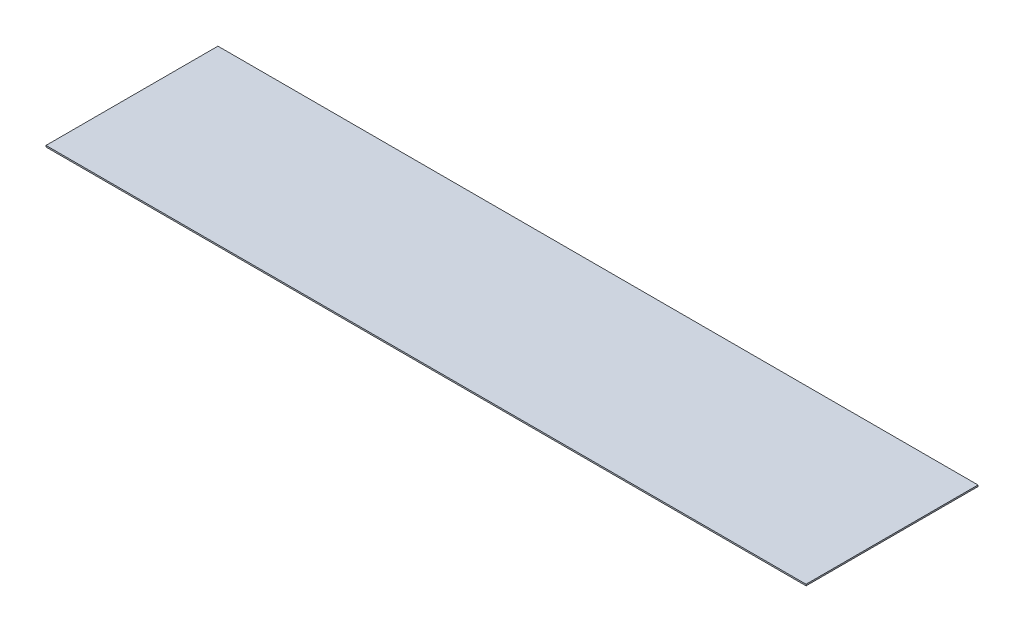
ISO-10303-21;
HEADER;
FILE_DESCRIPTION(('STEP AP214'),'2;1');
FILE_NAME('part.step','',(''),(''),'','','');
FILE_SCHEMA(('AUTOMOTIVE_DESIGN { 1 0 10303 214 1 1 1 1 }'));
ENDSEC;
DATA;
#1=APPLICATION_CONTEXT('core data for automotive mechanical design processes');
#2=APPLICATION_PROTOCOL_DEFINITION('international standard','automotive_design',2000,#1);
#3=PRODUCT_CONTEXT('',#1,'mechanical');
#4=PRODUCT('Part','Part','',(#3));
#5=PRODUCT_RELATED_PRODUCT_CATEGORY('part','',(#4));
#6=PRODUCT_DEFINITION_FORMATION('','',#4);
#7=PRODUCT_DEFINITION_CONTEXT('part definition',#1,'design');
#8=PRODUCT_DEFINITION('design','',#6,#7);
#9=PRODUCT_DEFINITION_SHAPE('','',#8);
#10=(LENGTH_UNIT() NAMED_UNIT(*) SI_UNIT(.MILLI.,.METRE.));
#11=(NAMED_UNIT(*) PLANE_ANGLE_UNIT() SI_UNIT($,.RADIAN.));
#12=(NAMED_UNIT(*) SI_UNIT($,.STERADIAN.) SOLID_ANGLE_UNIT());
#13=UNCERTAINTY_MEASURE_WITH_UNIT(LENGTH_MEASURE(1.E-05),#10,'distance_accuracy_value','');
#14=(GEOMETRIC_REPRESENTATION_CONTEXT(3) GLOBAL_UNCERTAINTY_ASSIGNED_CONTEXT((#13)) GLOBAL_UNIT_ASSIGNED_CONTEXT((#10,
#11,#12)) REPRESENTATION_CONTEXT('',''));
#15=CARTESIAN_POINT('',(0.,0.,0.));
#16=DIRECTION('',(0.,0.,1.));
#17=DIRECTION('',(1.,0.,0.));
#18=AXIS2_PLACEMENT_3D('',#15,#16,#17);
#19=CARTESIAN_POINT('',(6737.35,330.2,-1524.));
#20=DIRECTION('',(-1.,0.,0.));
#21=DIRECTION('',(0.,0.,1.));
#22=AXIS2_PLACEMENT_3D('',#19,#20,#21);
#23=PLANE('',#22);
#24=DIRECTION('',(0.,0.,-1.));
#25=VECTOR('',#24,1.);
#26=CARTESIAN_POINT('',(6737.35,304.8,-1524.));
#27=LINE('',#26,#25);
#28=CARTESIAN_POINT('',(6737.35,304.8,1524.));
#29=VERTEX_POINT('',#28);
#30=CARTESIAN_POINT('',(6737.35,304.8,-1524.));
#31=VERTEX_POINT('',#30);
#32=EDGE_CURVE('E109',#29,#31,#27,.T.);
#33=ORIENTED_EDGE('',*,*,#32,.T.);
#34=DIRECTION('',(0.,-1.,0.));
#35=VECTOR('',#34,1.);
#36=CARTESIAN_POINT('',(6737.35,330.2,-1524.));
#37=LINE('',#36,#35);
#38=CARTESIAN_POINT('',(6737.35,330.2,-1524.));
#39=VERTEX_POINT('',#38);
#40=EDGE_CURVE('E12',#39,#31,#37,.T.);
#41=ORIENTED_EDGE('',*,*,#40,.F.);
#42=DIRECTION('',(0.,0.,-1.));
#43=VECTOR('',#42,1.);
#44=CARTESIAN_POINT('',(6737.35,330.2,-1524.));
#45=LINE('',#44,#43);
#46=CARTESIAN_POINT('',(6737.35,330.2,1524.));
#47=VERTEX_POINT('',#46);
#48=EDGE_CURVE('E97',#47,#39,#45,.T.);
#49=ORIENTED_EDGE('',*,*,#48,.F.);
#50=DIRECTION('',(0.,-1.,0.));
#51=VECTOR('',#50,1.);
#52=CARTESIAN_POINT('',(6737.35,330.2,1524.));
#53=LINE('',#52,#51);
#54=EDGE_CURVE('E105',#47,#29,#53,.T.);
#55=ORIENTED_EDGE('',*,*,#54,.T.);
#56=EDGE_LOOP('',(#33,#41,#49,#55));
#57=FACE_BOUND('',#56,.T.);
#58=ADVANCED_FACE('F46',(#57),#23,.F.);
#59=CARTESIAN_POINT('',(-6737.35,330.2,-1524.));
#60=DIRECTION('',(0.,0.,1.));
#61=DIRECTION('',(1.,0.,0.));
#62=AXIS2_PLACEMENT_3D('',#59,#60,#61);
#63=PLANE('',#62);
#64=DIRECTION('',(-1.,0.,0.));
#65=VECTOR('',#64,1.);
#66=CARTESIAN_POINT('',(-6737.35,304.8,-1524.));
#67=LINE('',#66,#65);
#68=CARTESIAN_POINT('',(-6737.35,304.8,-1524.));
#69=VERTEX_POINT('',#68);
#70=EDGE_CURVE('E101',#31,#69,#67,.T.);
#71=ORIENTED_EDGE('',*,*,#70,.T.);
#72=DIRECTION('',(0.,-1.,0.));
#73=VECTOR('',#72,1.);
#74=CARTESIAN_POINT('',(-6737.35,330.2,-1524.));
#75=LINE('',#74,#73);
#76=CARTESIAN_POINT('',(-6737.35,330.2,-1524.));
#77=VERTEX_POINT('',#76);
#78=EDGE_CURVE('E54',#77,#69,#75,.T.);
#79=ORIENTED_EDGE('',*,*,#78,.F.);
#80=DIRECTION('',(-1.,0.,0.));
#81=VECTOR('',#80,1.);
#82=CARTESIAN_POINT('',(-6737.35,330.2,-1524.));
#83=LINE('',#82,#81);
#84=EDGE_CURVE('E92',#39,#77,#83,.T.);
#85=ORIENTED_EDGE('',*,*,#84,.F.);
#86=ORIENTED_EDGE('',*,*,#40,.T.);
#87=EDGE_LOOP('',(#71,#79,#85,#86));
#88=FACE_BOUND('',#87,.T.);
#89=ADVANCED_FACE('F100',(#88),#63,.F.);
#90=CARTESIAN_POINT('',(-6737.35,330.2,-1524.));
#91=DIRECTION('',(1.,0.,0.));
#92=DIRECTION('',(0.,0.,-1.));
#93=AXIS2_PLACEMENT_3D('',#90,#91,#92);
#94=PLANE('',#93);
#95=DIRECTION('',(0.,0.,1.));
#96=VECTOR('',#95,1.);
#97=CARTESIAN_POINT('',(-6737.35,304.8,-1524.));
#98=LINE('',#97,#96);
#99=CARTESIAN_POINT('',(-6737.35,304.8,1524.));
#100=VERTEX_POINT('',#99);
#101=EDGE_CURVE('E79',#69,#100,#98,.T.);
#102=ORIENTED_EDGE('',*,*,#101,.T.);
#103=DIRECTION('',(0.,-1.,0.));
#104=VECTOR('',#103,1.);
#105=CARTESIAN_POINT('',(-6737.35,330.2,1524.));
#106=LINE('',#105,#104);
#107=CARTESIAN_POINT('',(-6737.35,330.2,1524.));
#108=VERTEX_POINT('',#107);
#109=EDGE_CURVE('E102',#108,#100,#106,.T.);
#110=ORIENTED_EDGE('',*,*,#109,.F.);
#111=DIRECTION('',(0.,0.,1.));
#112=VECTOR('',#111,1.);
#113=CARTESIAN_POINT('',(-6737.35,330.2,-1524.));
#114=LINE('',#113,#112);
#115=EDGE_CURVE('E95',#77,#108,#114,.T.);
#116=ORIENTED_EDGE('',*,*,#115,.F.);
#117=ORIENTED_EDGE('',*,*,#78,.T.);
#118=EDGE_LOOP('',(#102,#110,#116,#117));
#119=FACE_BOUND('',#118,.T.);
#120=ADVANCED_FACE('F103',(#119),#94,.F.);
#121=CARTESIAN_POINT('',(-6737.35,330.2,1524.));
#122=DIRECTION('',(0.,0.,-1.));
#123=DIRECTION('',(-1.,0.,0.));
#124=AXIS2_PLACEMENT_3D('',#121,#122,#123);
#125=PLANE('',#124);
#126=DIRECTION('',(1.,0.,0.));
#127=VECTOR('',#126,1.);
#128=CARTESIAN_POINT('',(-6737.35,304.8,1524.));
#129=LINE('',#128,#127);
#130=EDGE_CURVE('E85',#100,#29,#129,.T.);
#131=ORIENTED_EDGE('',*,*,#130,.T.);
#132=ORIENTED_EDGE('',*,*,#54,.F.);
#133=DIRECTION('',(1.,0.,0.));
#134=VECTOR('',#133,1.);
#135=CARTESIAN_POINT('',(-6737.35,330.2,1524.));
#136=LINE('',#135,#134);
#137=EDGE_CURVE('E62',#108,#47,#136,.T.);
#138=ORIENTED_EDGE('',*,*,#137,.F.);
#139=ORIENTED_EDGE('',*,*,#109,.T.);
#140=EDGE_LOOP('',(#131,#132,#138,#139));
#141=FACE_BOUND('',#140,.T.);
#142=ADVANCED_FACE('F116',(#141),#125,.F.);
#143=CARTESIAN_POINT('',(0.,330.2,0.));
#144=DIRECTION('',(0.,1.,0.));
#145=DIRECTION('',(0.,0.,1.));
#146=AXIS2_PLACEMENT_3D('',#143,#144,#145);
#147=PLANE('',#146);
#148=ORIENTED_EDGE('',*,*,#48,.T.);
#149=ORIENTED_EDGE('',*,*,#84,.T.);
#150=ORIENTED_EDGE('',*,*,#115,.T.);
#151=ORIENTED_EDGE('',*,*,#137,.T.);
#152=EDGE_LOOP('',(#148,#149,#150,#151));
#153=FACE_BOUND('',#152,.T.);
#154=ADVANCED_FACE('F93',(#153),#147,.T.);
#155=CARTESIAN_POINT('',(0.,304.8,0.));
#156=DIRECTION('',(0.,1.,0.));
#157=DIRECTION('',(0.,0.,1.));
#158=AXIS2_PLACEMENT_3D('',#155,#156,#157);
#159=PLANE('',#158);
#160=ORIENTED_EDGE('',*,*,#32,.F.);
#161=ORIENTED_EDGE('',*,*,#130,.F.);
#162=ORIENTED_EDGE('',*,*,#101,.F.);
#163=ORIENTED_EDGE('',*,*,#70,.F.);
#164=EDGE_LOOP('',(#160,#161,#162,#163));
#165=FACE_BOUND('',#164,.T.);
#166=ADVANCED_FACE('F119',(#165),#159,.F.);
#167=CLOSED_SHELL('',(#58,#89,#120,#142,#154,#166));
#168=MANIFOLD_SOLID_BREP('B2',#167);
#169=CARTESIAN_POINT('',(6127.75,304.8,914.399999999999));
#170=DIRECTION('',(-1.,0.,0.));
#171=DIRECTION('',(0.,0.,1.));
#172=AXIS2_PLACEMENT_3D('',#169,#170,#171);
#173=PLANE('',#172);
#174=DIRECTION('',(0.,0.,-1.));
#175=VECTOR('',#174,1.);
#176=CARTESIAN_POINT('',(6127.75,0.,914.399999999999));
#177=LINE('',#176,#175);
#178=CARTESIAN_POINT('',(6127.75,0.,914.399999999999));
#179=VERTEX_POINT('',#178);
#180=CARTESIAN_POINT('',(6127.75,0.,-914.400000000002));
#181=VERTEX_POINT('',#180);
#182=EDGE_CURVE('E232',#179,#181,#177,.T.);
#183=ORIENTED_EDGE('',*,*,#182,.T.);
#184=DIRECTION('',(0.,-1.,0.));
#185=VECTOR('',#184,1.);
#186=CARTESIAN_POINT('',(6127.75,304.8,-914.400000000002));
#187=LINE('',#186,#185);
#188=CARTESIAN_POINT('',(6127.75,304.8,-914.400000000002));
#189=VERTEX_POINT('',#188);
#190=EDGE_CURVE('E44',#189,#181,#187,.T.);
#191=ORIENTED_EDGE('',*,*,#190,.F.);
#192=DIRECTION('',(0.,0.,-1.));
#193=VECTOR('',#192,1.);
#194=CARTESIAN_POINT('',(6127.75,304.8,914.399999999999));
#195=LINE('',#194,#193);
#196=CARTESIAN_POINT('',(6127.75,304.8,914.399999999999));
#197=VERTEX_POINT('',#196);
#198=EDGE_CURVE('E220',#197,#189,#195,.T.);
#199=ORIENTED_EDGE('',*,*,#198,.F.);
#200=DIRECTION('',(0.,-1.,0.));
#201=VECTOR('',#200,1.);
#202=CARTESIAN_POINT('',(6127.75,304.8,914.399999999999));
#203=LINE('',#202,#201);
#204=EDGE_CURVE('E228',#197,#179,#203,.T.);
#205=ORIENTED_EDGE('',*,*,#204,.T.);
#206=EDGE_LOOP('',(#183,#191,#199,#205));
#207=FACE_BOUND('',#206,.T.);
#208=ADVANCED_FACE('F169',(#207),#173,.F.);
#209=CARTESIAN_POINT('',(-6127.75,304.8,-914.4));
#210=DIRECTION('',(0.,0.,1.));
#211=DIRECTION('',(1.,0.,0.));
#212=AXIS2_PLACEMENT_3D('',#209,#210,#211);
#213=PLANE('',#212);
#214=DIRECTION('',(-1.,0.,0.));
#215=VECTOR('',#214,1.);
#216=CARTESIAN_POINT('',(-6127.75,0.,-914.4));
#217=LINE('',#216,#215);
#218=CARTESIAN_POINT('',(-6127.75,0.,-914.4));
#219=VERTEX_POINT('',#218);
#220=EDGE_CURVE('E224',#181,#219,#217,.T.);
#221=ORIENTED_EDGE('',*,*,#220,.T.);
#222=DIRECTION('',(0.,-1.,0.));
#223=VECTOR('',#222,1.);
#224=CARTESIAN_POINT('',(-6127.75,304.8,-914.4));
#225=LINE('',#224,#223);
#226=CARTESIAN_POINT('',(-6127.75,304.8,-914.4));
#227=VERTEX_POINT('',#226);
#228=EDGE_CURVE('E177',#227,#219,#225,.T.);
#229=ORIENTED_EDGE('',*,*,#228,.F.);
#230=DIRECTION('',(-1.,0.,0.));
#231=VECTOR('',#230,1.);
#232=CARTESIAN_POINT('',(-6127.75,304.8,-914.4));
#233=LINE('',#232,#231);
#234=EDGE_CURVE('E215',#189,#227,#233,.T.);
#235=ORIENTED_EDGE('',*,*,#234,.F.);
#236=ORIENTED_EDGE('',*,*,#190,.T.);
#237=EDGE_LOOP('',(#221,#229,#235,#236));
#238=FACE_BOUND('',#237,.T.);
#239=ADVANCED_FACE('F223',(#238),#213,.F.);
#240=CARTESIAN_POINT('',(-6127.75,304.8,914.4));
#241=DIRECTION('',(1.,0.,0.));
#242=DIRECTION('',(0.,0.,-1.));
#243=AXIS2_PLACEMENT_3D('',#240,#241,#242);
#244=PLANE('',#243);
#245=DIRECTION('',(0.,0.,1.));
#246=VECTOR('',#245,1.);
#247=CARTESIAN_POINT('',(-6127.75,0.,914.4));
#248=LINE('',#247,#246);
#249=CARTESIAN_POINT('',(-6127.75,0.,914.4));
#250=VERTEX_POINT('',#249);
#251=EDGE_CURVE('E202',#219,#250,#248,.T.);
#252=ORIENTED_EDGE('',*,*,#251,.T.);
#253=DIRECTION('',(0.,-1.,0.));
#254=VECTOR('',#253,1.);
#255=CARTESIAN_POINT('',(-6127.75,304.8,914.4));
#256=LINE('',#255,#254);
#257=CARTESIAN_POINT('',(-6127.75,304.8,914.4));
#258=VERTEX_POINT('',#257);
#259=EDGE_CURVE('E225',#258,#250,#256,.T.);
#260=ORIENTED_EDGE('',*,*,#259,.F.);
#261=DIRECTION('',(0.,0.,1.));
#262=VECTOR('',#261,1.);
#263=CARTESIAN_POINT('',(-6127.75,304.8,914.4));
#264=LINE('',#263,#262);
#265=EDGE_CURVE('E218',#227,#258,#264,.T.);
#266=ORIENTED_EDGE('',*,*,#265,.F.);
#267=ORIENTED_EDGE('',*,*,#228,.T.);
#268=EDGE_LOOP('',(#252,#260,#266,#267));
#269=FACE_BOUND('',#268,.T.);
#270=ADVANCED_FACE('F226',(#269),#244,.F.);
#271=CARTESIAN_POINT('',(-6127.75,304.8,914.4));
#272=DIRECTION('',(0.,0.,-1.));
#273=DIRECTION('',(-1.,0.,0.));
#274=AXIS2_PLACEMENT_3D('',#271,#272,#273);
#275=PLANE('',#274);
#276=DIRECTION('',(1.,0.,0.));
#277=VECTOR('',#276,1.);
#278=CARTESIAN_POINT('',(-6127.75,0.,914.4));
#279=LINE('',#278,#277);
#280=EDGE_CURVE('E208',#250,#179,#279,.T.);
#281=ORIENTED_EDGE('',*,*,#280,.T.);
#282=ORIENTED_EDGE('',*,*,#204,.F.);
#283=DIRECTION('',(1.,0.,0.));
#284=VECTOR('',#283,1.);
#285=CARTESIAN_POINT('',(-6127.75,304.8,914.4));
#286=LINE('',#285,#284);
#287=EDGE_CURVE('E185',#258,#197,#286,.T.);
#288=ORIENTED_EDGE('',*,*,#287,.F.);
#289=ORIENTED_EDGE('',*,*,#259,.T.);
#290=EDGE_LOOP('',(#281,#282,#288,#289));
#291=FACE_BOUND('',#290,.T.);
#292=ADVANCED_FACE('F239',(#291),#275,.F.);
#293=CARTESIAN_POINT('',(0.,304.8,0.));
#294=DIRECTION('',(0.,-1.,0.));
#295=DIRECTION('',(0.,0.,-1.));
#296=AXIS2_PLACEMENT_3D('',#293,#294,#295);
#297=PLANE('',#296);
#298=ORIENTED_EDGE('',*,*,#198,.T.);
#299=ORIENTED_EDGE('',*,*,#234,.T.);
#300=ORIENTED_EDGE('',*,*,#265,.T.);
#301=ORIENTED_EDGE('',*,*,#287,.T.);
#302=EDGE_LOOP('',(#298,#299,#300,#301));
#303=FACE_BOUND('',#302,.T.);
#304=ADVANCED_FACE('F216',(#303),#297,.F.);
#305=CARTESIAN_POINT('',(0.,0.,0.));
#306=DIRECTION('',(0.,-1.,0.));
#307=DIRECTION('',(0.,0.,-1.));
#308=AXIS2_PLACEMENT_3D('',#305,#306,#307);
#309=PLANE('',#308);
#310=ORIENTED_EDGE('',*,*,#182,.F.);
#311=ORIENTED_EDGE('',*,*,#280,.F.);
#312=ORIENTED_EDGE('',*,*,#251,.F.);
#313=ORIENTED_EDGE('',*,*,#220,.F.);
#314=EDGE_LOOP('',(#310,#311,#312,#313));
#315=FACE_BOUND('',#314,.T.);
#316=ADVANCED_FACE('F242',(#315),#309,.T.);
#317=CLOSED_SHELL('',(#208,#239,#270,#292,#304,#316));
#318=MANIFOLD_SOLID_BREP('B6',#317);
#319=ADVANCED_BREP_SHAPE_REPRESENTATION('',(#18,#168,#318),#14);
#320=SHAPE_DEFINITION_REPRESENTATION(#9,#319);
ENDSEC;
END-ISO-10303-21;
